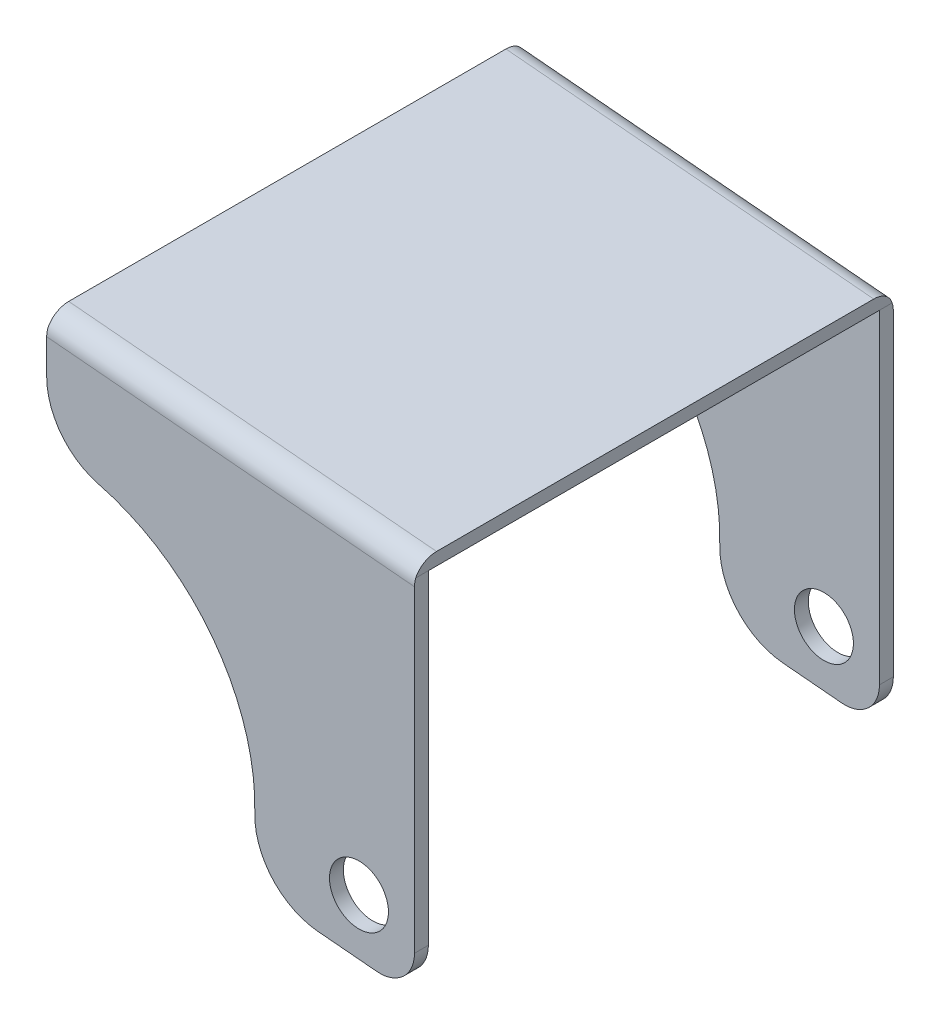
ISO-10303-21;
HEADER;
FILE_DESCRIPTION(('STEP AP214'),'2;1');
FILE_NAME('part.step','',(''),(''),'','','');
FILE_SCHEMA(('AUTOMOTIVE_DESIGN { 1 0 10303 214 1 1 1 1 }'));
ENDSEC;
DATA;
#1=APPLICATION_CONTEXT('core data for automotive mechanical design processes');
#2=APPLICATION_PROTOCOL_DEFINITION('international standard','automotive_design',2000,#1);
#3=PRODUCT_CONTEXT('',#1,'mechanical');
#4=PRODUCT('Part','Part','',(#3));
#5=PRODUCT_RELATED_PRODUCT_CATEGORY('part','',(#4));
#6=PRODUCT_DEFINITION_FORMATION('','',#4);
#7=PRODUCT_DEFINITION_CONTEXT('part definition',#1,'design');
#8=PRODUCT_DEFINITION('design','',#6,#7);
#9=PRODUCT_DEFINITION_SHAPE('','',#8);
#10=(LENGTH_UNIT() NAMED_UNIT(*) SI_UNIT(.MILLI.,.METRE.));
#11=(NAMED_UNIT(*) PLANE_ANGLE_UNIT() SI_UNIT($,.RADIAN.));
#12=(NAMED_UNIT(*) SI_UNIT($,.STERADIAN.) SOLID_ANGLE_UNIT());
#13=UNCERTAINTY_MEASURE_WITH_UNIT(LENGTH_MEASURE(1.E-05),#10,'distance_accuracy_value','');
#14=(GEOMETRIC_REPRESENTATION_CONTEXT(3) GLOBAL_UNCERTAINTY_ASSIGNED_CONTEXT((#13)) GLOBAL_UNIT_ASSIGNED_CONTEXT((#10,
#11,#12)) REPRESENTATION_CONTEXT('',''));
#15=CARTESIAN_POINT('',(0.,0.,0.));
#16=DIRECTION('',(0.,0.,1.));
#17=DIRECTION('',(1.,0.,0.));
#18=AXIS2_PLACEMENT_3D('',#15,#16,#17);
#19=CARTESIAN_POINT('',(-17.5,15.5152316254717,2.));
#20=DIRECTION('',(0.,0.,-1.));
#21=DIRECTION('',(-1.,0.,0.));
#22=AXIS2_PLACEMENT_3D('',#19,#20,#21);
#23=CYLINDRICAL_SURFACE('',#22,10.);
#24=CARTESIAN_POINT('',(-17.5,15.5152316254717,0.));
#25=DIRECTION('',(0.,0.,1.));
#26=DIRECTION('',(-1.,0.,0.));
#27=AXIS2_PLACEMENT_3D('',#24,#25,#26);
#28=CIRCLE('',#27,10.);
#29=CARTESIAN_POINT('',(-27.5,15.5152316254717,0.));
#30=VERTEX_POINT('',#29);
#31=CARTESIAN_POINT('',(-20.,5.83277325995317,0.));
#32=VERTEX_POINT('',#31);
#33=EDGE_CURVE('E277',#30,#32,#28,.T.);
#34=ORIENTED_EDGE('',*,*,#33,.T.);
#35=DIRECTION('',(0.,0.,-1.));
#36=VECTOR('',#35,1.);
#37=CARTESIAN_POINT('',(-20.,5.83277325995317,2.));
#38=LINE('',#37,#36);
#39=CARTESIAN_POINT('',(-20.,5.83277325995317,2.));
#40=VERTEX_POINT('',#39);
#41=EDGE_CURVE('E306',#40,#32,#38,.T.);
#42=ORIENTED_EDGE('',*,*,#41,.F.);
#43=CARTESIAN_POINT('',(-17.5,15.5152316254717,2.));
#44=DIRECTION('',(0.,0.,1.));
#45=DIRECTION('',(-1.,0.,0.));
#46=AXIS2_PLACEMENT_3D('',#43,#44,#45);
#47=CIRCLE('',#46,10.);
#48=CARTESIAN_POINT('',(-27.5,15.5152316254717,2.));
#49=VERTEX_POINT('',#48);
#50=EDGE_CURVE('E260',#49,#40,#47,.T.);
#51=ORIENTED_EDGE('',*,*,#50,.F.);
#52=DIRECTION('',(0.,0.,-1.));
#53=VECTOR('',#52,1.);
#54=CARTESIAN_POINT('',(-27.5,15.5152316254717,2.));
#55=LINE('',#54,#53);
#56=EDGE_CURVE('E276',#49,#30,#55,.T.);
#57=ORIENTED_EDGE('',*,*,#56,.T.);
#58=EDGE_LOOP('',(#34,#42,#51,#57));
#59=FACE_BOUND('',#58,.T.);
#60=ADVANCED_FACE('F33',(#59),#23,.T.);
#61=CARTESIAN_POINT('',(-27.5,-23.2146018366025,2.));
#62=DIRECTION('',(0.,0.,-1.));
#63=DIRECTION('',(-1.,0.,0.));
#64=AXIS2_PLACEMENT_3D('',#61,#62,#63);
#65=CYLINDRICAL_SURFACE('',#64,30.);
#66=CARTESIAN_POINT('',(-27.5,-23.2146018366025,0.));
#67=DIRECTION('',(0.,0.,-1.));
#68=DIRECTION('',(1.,0.,0.));
#69=AXIS2_PLACEMENT_3D('',#66,#67,#68);
#70=CIRCLE('',#69,30.);
#71=CARTESIAN_POINT('',(2.49062939224369,-23.9643675714085,0.));
#72=VERTEX_POINT('',#71);
#73=EDGE_CURVE('E280',#32,#72,#70,.T.);
#74=ORIENTED_EDGE('',*,*,#73,.T.);
#75=DIRECTION('',(0.,0.,-1.));
#76=VECTOR('',#75,1.);
#77=CARTESIAN_POINT('',(2.49062939224369,-23.9643675714085,2.));
#78=LINE('',#77,#76);
#79=CARTESIAN_POINT('',(2.49062939224369,-23.9643675714085,2.));
#80=VERTEX_POINT('',#79);
#81=EDGE_CURVE('E303',#80,#72,#78,.T.);
#82=ORIENTED_EDGE('',*,*,#81,.F.);
#83=CARTESIAN_POINT('',(-27.5,-23.2146018366025,2.));
#84=DIRECTION('',(0.,0.,-1.));
#85=DIRECTION('',(1.,0.,0.));
#86=AXIS2_PLACEMENT_3D('',#83,#84,#85);
#87=CIRCLE('',#86,30.);
#88=EDGE_CURVE('E263',#40,#80,#87,.T.);
#89=ORIENTED_EDGE('',*,*,#88,.F.);
#90=ORIENTED_EDGE('',*,*,#41,.T.);
#91=EDGE_LOOP('',(#74,#82,#89,#90));
#92=FACE_BOUND('',#91,.T.);
#93=ADVANCED_FACE('F403',(#92),#65,.F.);
#94=CARTESIAN_POINT('',(12.4875058563249,-24.2142894830106,2.));
#95=DIRECTION('',(0.,0.,-1.));
#96=DIRECTION('',(-1.,0.,0.));
#97=AXIS2_PLACEMENT_3D('',#94,#95,#96);
#98=CYLINDRICAL_SURFACE('',#97,10.);
#99=CARTESIAN_POINT('',(12.4875058563249,-24.2142894830106,0.));
#100=DIRECTION('',(0.,0.,1.));
#101=DIRECTION('',(-1.,0.,0.));
#102=AXIS2_PLACEMENT_3D('',#99,#100,#101);
#103=CIRCLE('',#102,10.);
#104=CARTESIAN_POINT('',(11.6031780779769,-34.1751109541766,0.));
#105=VERTEX_POINT('',#104);
#106=EDGE_CURVE('E282',#72,#105,#103,.T.);
#107=ORIENTED_EDGE('',*,*,#106,.T.);
#108=DIRECTION('',(0.,0.,-1.));
#109=VECTOR('',#108,1.);
#110=CARTESIAN_POINT('',(11.6031780779769,-34.1751109541766,2.));
#111=LINE('',#110,#109);
#112=CARTESIAN_POINT('',(11.6031780779769,-34.1751109541766,2.));
#113=VERTEX_POINT('',#112);
#114=EDGE_CURVE('E300',#113,#105,#111,.T.);
#115=ORIENTED_EDGE('',*,*,#114,.F.);
#116=CARTESIAN_POINT('',(12.4875058563249,-24.2142894830106,2.));
#117=DIRECTION('',(0.,0.,1.));
#118=DIRECTION('',(-1.,0.,0.));
#119=AXIS2_PLACEMENT_3D('',#116,#117,#118);
#120=CIRCLE('',#119,10.);
#121=EDGE_CURVE('E266',#80,#113,#120,.T.);
#122=ORIENTED_EDGE('',*,*,#121,.F.);
#123=ORIENTED_EDGE('',*,*,#81,.T.);
#124=EDGE_LOOP('',(#107,#115,#122,#123));
#125=FACE_BOUND('',#124,.T.);
#126=ADVANCED_FACE('F409',(#125),#98,.T.);
#127=CARTESIAN_POINT('',(25.5,-35.4088792424623,2.));
#128=DIRECTION('',(0.0884327778347987,0.996082147116603,0.));
#129=DIRECTION('',(-0.996082147116603,0.0884327778347987,0.));
#130=AXIS2_PLACEMENT_3D('',#127,#128,#129);
#131=PLANE('',#130);
#132=DIRECTION('',(0.996082147116603,-0.0884327778347987,0.));
#133=VECTOR('',#132,1.);
#134=CARTESIAN_POINT('',(25.5,-35.4088792424623,0.));
#135=LINE('',#134,#133);
#136=CARTESIAN_POINT('',(20.057836110826,-34.9257206279394,0.));
#137=VERTEX_POINT('',#136);
#138=EDGE_CURVE('E284',#105,#137,#135,.T.);
#139=ORIENTED_EDGE('',*,*,#138,.T.);
#140=DIRECTION('',(0.,0.,-1.));
#141=VECTOR('',#140,1.);
#142=CARTESIAN_POINT('',(20.057836110826,-34.9257206279394,2.));
#143=LINE('',#142,#141);
#144=CARTESIAN_POINT('',(20.057836110826,-34.9257206279394,2.));
#145=VERTEX_POINT('',#144);
#146=EDGE_CURVE('E314',#137,#145,#143,.F.);
#147=ORIENTED_EDGE('',*,*,#146,.T.);
#148=DIRECTION('',(0.996082147116603,-0.0884327778347987,0.));
#149=VECTOR('',#148,1.);
#150=CARTESIAN_POINT('',(25.5,-35.4088792424623,2.));
#151=LINE('',#150,#149);
#152=EDGE_CURVE('E268',#113,#145,#151,.T.);
#153=ORIENTED_EDGE('',*,*,#152,.F.);
#154=ORIENTED_EDGE('',*,*,#114,.T.);
#155=EDGE_LOOP('',(#139,#147,#153,#154));
#156=FACE_BOUND('',#155,.T.);
#157=ADVANCED_FACE('F471',(#156),#131,.F.);
#158=CARTESIAN_POINT('',(25.5,16.7956504246203,2.));
#159=DIRECTION('',(-1.,0.,0.));
#160=DIRECTION('',(0.,-1.,0.));
#161=AXIS2_PLACEMENT_3D('',#158,#159,#160);
#162=PLANE('',#161);
#163=DIRECTION('',(0.,0.,-1.));
#164=VECTOR('',#163,1.);
#165=CARTESIAN_POINT('',(25.5,16.7956504246203,2.));
#166=LINE('',#165,#164);
#167=CARTESIAN_POINT('',(25.5,16.7956504246203,1.82842712474619));
#168=VERTEX_POINT('',#167);
#169=CARTESIAN_POINT('',(25.5,16.7956504246203,0.));
#170=VERTEX_POINT('',#169);
#171=EDGE_CURVE('E298',#168,#170,#166,.T.);
#172=ORIENTED_EDGE('',*,*,#171,.F.);
#173=CARTESIAN_POINT('',(25.5,15.7917171617918,-1.));
#174=DIRECTION('',(-1.,0.,0.));
#175=DIRECTION('',(0.,1.,0.));
#176=AXIS2_PLACEMENT_3D('',#173,#174,#175);
#177=ELLIPSE('',#176,3.01179978848553,3.);
#178=CARTESIAN_POINT('',(25.5,15.7917171617918,2.));
#179=VERTEX_POINT('',#178);
#180=EDGE_CURVE('E330',#168,#179,#177,.F.);
#181=ORIENTED_EDGE('',*,*,#180,.T.);
#182=DIRECTION('',(0.,1.,0.));
#183=VECTOR('',#182,1.);
#184=CARTESIAN_POINT('',(25.5,16.7956504246203,2.));
#185=LINE('',#184,#183);
#186=CARTESIAN_POINT('',(25.5,-29.9453098923564,2.));
#187=VERTEX_POINT('',#186);
#188=EDGE_CURVE('E271',#187,#179,#185,.T.);
#189=ORIENTED_EDGE('',*,*,#188,.F.);
#190=DIRECTION('',(0.,0.,-1.));
#191=VECTOR('',#190,1.);
#192=CARTESIAN_POINT('',(25.5,-29.9453098923564,2.));
#193=LINE('',#192,#191);
#194=CARTESIAN_POINT('',(25.5,-29.9453098923564,0.));
#195=VERTEX_POINT('',#194);
#196=EDGE_CURVE('E309',#187,#195,#193,.T.);
#197=ORIENTED_EDGE('',*,*,#196,.T.);
#198=DIRECTION('',(0.,1.,0.));
#199=VECTOR('',#198,1.);
#200=CARTESIAN_POINT('',(25.5,16.7956504246203,0.));
#201=LINE('',#200,#199);
#202=EDGE_CURVE('E287',#195,#170,#201,.T.);
#203=ORIENTED_EDGE('',*,*,#202,.T.);
#204=EDGE_LOOP('',(#172,#181,#189,#197,#203));
#205=FACE_BOUND('',#204,.T.);
#206=ADVANCED_FACE('F360',(#205),#162,.F.);
#207=CARTESIAN_POINT('',(-27.5,15.5152316254717,2.));
#208=DIRECTION('',(1.,0.,0.));
#209=DIRECTION('',(0.,0.,-1.));
#210=AXIS2_PLACEMENT_3D('',#207,#208,#209);
#211=PLANE('',#210);
#212=DIRECTION('',(0.,-1.,0.));
#213=VECTOR('',#212,1.);
#214=CARTESIAN_POINT('',(-27.5,15.5152316254717,2.));
#215=LINE('',#214,#213);
#216=CARTESIAN_POINT('',(-27.5,20.4970893430037,2.));
#217=VERTEX_POINT('',#216);
#218=EDGE_CURVE('E274',#217,#49,#215,.T.);
#219=ORIENTED_EDGE('',*,*,#218,.F.);
#220=CARTESIAN_POINT('',(-27.5,20.4970893430037,-1.));
#221=DIRECTION('',(1.,0.,0.));
#222=DIRECTION('',(0.,1.,0.));
#223=AXIS2_PLACEMENT_3D('',#220,#221,#222);
#224=ELLIPSE('',#223,3.01179978848553,3.);
#225=CARTESIAN_POINT('',(-27.5,21.5010226058322,1.82842712474619));
#226=VERTEX_POINT('',#225);
#227=EDGE_CURVE('E334',#217,#226,#224,.F.);
#228=ORIENTED_EDGE('',*,*,#227,.T.);
#229=DIRECTION('',(0.,0.,-1.));
#230=VECTOR('',#229,1.);
#231=CARTESIAN_POINT('',(-27.5,21.5010226058322,2.));
#232=LINE('',#231,#230);
#233=CARTESIAN_POINT('',(-27.5,21.5010226058322,0.));
#234=VERTEX_POINT('',#233);
#235=EDGE_CURVE('E296',#226,#234,#232,.T.);
#236=ORIENTED_EDGE('',*,*,#235,.T.);
#237=DIRECTION('',(0.,-1.,0.));
#238=VECTOR('',#237,1.);
#239=CARTESIAN_POINT('',(-27.5,15.5152316254717,0.));
#240=LINE('',#239,#238);
#241=EDGE_CURVE('E264',#234,#30,#240,.T.);
#242=ORIENTED_EDGE('',*,*,#241,.T.);
#243=ORIENTED_EDGE('',*,*,#56,.F.);
#244=EDGE_LOOP('',(#219,#228,#236,#242,#243));
#245=FACE_BOUND('',#244,.T.);
#246=ADVANCED_FACE('F470',(#245),#211,.F.);
#247=CARTESIAN_POINT('',(-17.5,15.5152316254717,2.));
#248=DIRECTION('',(0.,0.,-1.));
#249=DIRECTION('',(-1.,0.,0.));
#250=AXIS2_PLACEMENT_3D('',#247,#248,#249);
#251=PLANE('',#250);
#252=CARTESIAN_POINT('',(17.5,-26.6671682822928,2.));
#253=DIRECTION('',(0.,0.,1.));
#254=DIRECTION('',(1.,0.,0.));
#255=AXIS2_PLACEMENT_3D('',#252,#253,#254);
#256=CIRCLE('',#255,4.25);
#257=CARTESIAN_POINT('',(21.75,-26.6671682822928,2.));
#258=VERTEX_POINT('',#257);
#259=EDGE_CURVE('E252',#258,#258,#256,.T.);
#260=ORIENTED_EDGE('',*,*,#259,.F.);
#261=EDGE_LOOP('',(#260));
#262=FACE_BOUND('',#261,.T.);
#263=ORIENTED_EDGE('',*,*,#188,.T.);
#264=DIRECTION('',(0.996082147116603,-0.0884327778347982,0.));
#265=VECTOR('',#264,1.);
#266=CARTESIAN_POINT('',(-27.5884327778348,20.5049404587156,2.));
#267=LINE('',#266,#265);
#268=EDGE_CURVE('E332',#179,#217,#267,.F.);
#269=ORIENTED_EDGE('',*,*,#268,.T.);
#270=ORIENTED_EDGE('',*,*,#218,.T.);
#271=ORIENTED_EDGE('',*,*,#50,.T.);
#272=ORIENTED_EDGE('',*,*,#88,.T.);
#273=ORIENTED_EDGE('',*,*,#121,.T.);
#274=ORIENTED_EDGE('',*,*,#152,.T.);
#275=CARTESIAN_POINT('',(20.5,-29.9453098923564,2.));
#276=DIRECTION('',(0.,0.,-1.));
#277=DIRECTION('',(-1.,0.,0.));
#278=AXIS2_PLACEMENT_3D('',#275,#276,#277);
#279=CIRCLE('',#278,5.);
#280=EDGE_CURVE('E316',#145,#187,#279,.F.);
#281=ORIENTED_EDGE('',*,*,#280,.T.);
#282=EDGE_LOOP('',(#263,#269,#270,#271,#272,#273,#274,#281));
#283=FACE_BOUND('',#282,.T.);
#284=ADVANCED_FACE('F482',(#262,#283),#251,.F.);
#285=CARTESIAN_POINT('',(-17.5,15.5152316254717,0.));
#286=DIRECTION('',(0.,0.,-1.));
#287=DIRECTION('',(-1.,0.,0.));
#288=AXIS2_PLACEMENT_3D('',#285,#286,#287);
#289=PLANE('',#288);
#290=CARTESIAN_POINT('',(17.5,-26.6671682822928,0.));
#291=DIRECTION('',(0.,0.,-1.));
#292=DIRECTION('',(-1.,0.,0.));
#293=AXIS2_PLACEMENT_3D('',#290,#291,#292);
#294=CIRCLE('',#293,4.25);
#295=CARTESIAN_POINT('',(13.25,-26.6671682822928,0.));
#296=VERTEX_POINT('',#295);
#297=EDGE_CURVE('E259',#296,#296,#294,.T.);
#298=ORIENTED_EDGE('',*,*,#297,.F.);
#299=EDGE_LOOP('',(#298));
#300=FACE_BOUND('',#299,.T.);
#301=ORIENTED_EDGE('',*,*,#202,.F.);
#302=CARTESIAN_POINT('',(20.5,-29.9453098923564,0.));
#303=DIRECTION('',(0.,0.,-1.));
#304=DIRECTION('',(-1.,0.,0.));
#305=AXIS2_PLACEMENT_3D('',#302,#303,#304);
#306=CIRCLE('',#305,5.);
#307=EDGE_CURVE('E312',#195,#137,#306,.T.);
#308=ORIENTED_EDGE('',*,*,#307,.T.);
#309=ORIENTED_EDGE('',*,*,#138,.F.);
#310=ORIENTED_EDGE('',*,*,#106,.F.);
#311=ORIENTED_EDGE('',*,*,#73,.F.);
#312=ORIENTED_EDGE('',*,*,#33,.F.);
#313=ORIENTED_EDGE('',*,*,#241,.F.);
#314=DIRECTION('',(-0.996082147116603,0.0884327778347981,0.));
#315=VECTOR('',#314,1.);
#316=CARTESIAN_POINT('',(-27.5,21.5010226058322,0.));
#317=LINE('',#316,#315);
#318=EDGE_CURVE('E290',#170,#234,#317,.T.);
#319=ORIENTED_EDGE('',*,*,#318,.F.);
#320=EDGE_LOOP('',(#301,#308,#309,#310,#311,#312,#313,#319));
#321=FACE_BOUND('',#320,.T.);
#322=ADVANCED_FACE('F368',(#300,#321),#289,.T.);
#323=CARTESIAN_POINT('',(20.5,-29.9453098923564,2.));
#324=DIRECTION('',(0.,0.,-1.));
#325=DIRECTION('',(-1.,0.,0.));
#326=AXIS2_PLACEMENT_3D('',#323,#324,#325);
#327=CYLINDRICAL_SURFACE('',#326,5.);
#328=ORIENTED_EDGE('',*,*,#280,.F.);
#329=ORIENTED_EDGE('',*,*,#146,.F.);
#330=ORIENTED_EDGE('',*,*,#307,.F.);
#331=ORIENTED_EDGE('',*,*,#196,.F.);
#332=EDGE_LOOP('',(#328,#329,#330,#331));
#333=FACE_BOUND('',#332,.T.);
#334=ADVANCED_FACE('F414',(#333),#327,.T.);
#335=CARTESIAN_POINT('',(17.5,-26.6671682822928,-8.));
#336=DIRECTION('',(0.,0.,1.));
#337=DIRECTION('',(1.,0.,0.));
#338=AXIS2_PLACEMENT_3D('',#335,#336,#337);
#339=CYLINDRICAL_SURFACE('',#338,4.25);
#340=ORIENTED_EDGE('',*,*,#297,.T.);
#341=EDGE_LOOP('',(#340));
#342=FACE_BOUND('',#341,.T.);
#343=ORIENTED_EDGE('',*,*,#259,.T.);
#344=EDGE_LOOP('',(#343));
#345=FACE_BOUND('',#344,.T.);
#346=ADVANCED_FACE('F416',(#342,#345),#339,.F.);
#347=CARTESIAN_POINT('',(-27.3231344443304,23.4931869000654,-67.));
#348=DIRECTION('',(0.996082147116603,-0.0884327778347981,0.));
#349=DIRECTION('',(0.0884327778347981,0.996082147116603,0.));
#350=AXIS2_PLACEMENT_3D('',#347,#348,#349);
#351=PLANE('',#350);
#352=ORIENTED_EDGE('',*,*,#235,.F.);
#353=CARTESIAN_POINT('',(-27.5884327778348,20.5049404587156,-1.));
#354=DIRECTION('',(0.996082147116603,-0.0884327778347981,0.));
#355=DIRECTION('',(0.0884327778347981,0.996082147116603,0.));
#356=AXIS2_PLACEMENT_3D('',#353,#354,#355);
#357=CIRCLE('',#356,3.);
#358=CARTESIAN_POINT('',(-27.3231344443304,23.4931869000654,-1.));
#359=VERTEX_POINT('',#358);
#360=EDGE_CURVE('E338',#226,#359,#357,.F.);
#361=ORIENTED_EDGE('',*,*,#360,.T.);
#362=DIRECTION('',(0.,0.,1.));
#363=VECTOR('',#362,1.);
#364=CARTESIAN_POINT('',(-27.3231344443304,23.4931869000654,-67.));
#365=LINE('',#364,#363);
#366=CARTESIAN_POINT('',(-27.3231344443304,23.4931869000654,-64.));
#367=VERTEX_POINT('',#366);
#368=EDGE_CURVE('E245',#367,#359,#365,.T.);
#369=ORIENTED_EDGE('',*,*,#368,.F.);
#370=CARTESIAN_POINT('',(-27.5884327778348,20.5049404587156,-64.));
#371=DIRECTION('',(0.996082147116603,-0.0884327778347981,0.));
#372=DIRECTION('',(0.0884327778347981,0.996082147116603,0.));
#373=AXIS2_PLACEMENT_3D('',#370,#371,#372);
#374=CIRCLE('',#373,3.);
#375=CARTESIAN_POINT('',(-27.5,21.5010226058322,-66.8284271247462));
#376=VERTEX_POINT('',#375);
#377=EDGE_CURVE('E336',#367,#376,#374,.F.);
#378=ORIENTED_EDGE('',*,*,#377,.T.);
#379=DIRECTION('',(0.,0.,1.));
#380=VECTOR('',#379,1.);
#381=CARTESIAN_POINT('',(-27.5,21.5010226058322,-67.));
#382=LINE('',#381,#380);
#383=CARTESIAN_POINT('',(-27.5,21.5010226058322,-65.));
#384=VERTEX_POINT('',#383);
#385=EDGE_CURVE('E253',#376,#384,#382,.T.);
#386=ORIENTED_EDGE('',*,*,#385,.T.);
#387=EDGE_CURVE('E242',#384,#234,#382,.T.);
#388=ORIENTED_EDGE('',*,*,#387,.T.);
#389=EDGE_LOOP('',(#352,#361,#369,#378,#386,#388));
#390=FACE_BOUND('',#389,.T.);
#391=ADVANCED_FACE('F344',(#390),#351,.F.);
#392=CARTESIAN_POINT('',(25.6768655556696,18.7878147188535,-67.));
#393=DIRECTION('',(-0.996082147116603,0.0884327778347981,0.));
#394=DIRECTION('',(-0.0884327778347981,-0.996082147116603,0.));
#395=AXIS2_PLACEMENT_3D('',#392,#393,#394);
#396=PLANE('',#395);
#397=DIRECTION('',(0.,0.,-1.));
#398=VECTOR('',#397,1.);
#399=CARTESIAN_POINT('',(25.6768655556696,18.7878147188535,-67.));
#400=LINE('',#399,#398);
#401=CARTESIAN_POINT('',(25.6768655556696,18.7878147188535,-1.));
#402=VERTEX_POINT('',#401);
#403=CARTESIAN_POINT('',(25.6768655556696,18.7878147188535,-64.));
#404=VERTEX_POINT('',#403);
#405=EDGE_CURVE('E248',#402,#404,#400,.T.);
#406=ORIENTED_EDGE('',*,*,#405,.F.);
#407=CARTESIAN_POINT('',(25.4115672221652,15.7995682775037,-1.));
#408=DIRECTION('',(-0.996082147116603,0.0884327778347981,0.));
#409=DIRECTION('',(-0.0884327778347981,-0.996082147116603,0.));
#410=AXIS2_PLACEMENT_3D('',#407,#408,#409);
#411=CIRCLE('',#410,3.);
#412=EDGE_CURVE('E328',#402,#168,#411,.F.);
#413=ORIENTED_EDGE('',*,*,#412,.T.);
#414=ORIENTED_EDGE('',*,*,#171,.T.);
#415=DIRECTION('',(0.,0.,-1.));
#416=VECTOR('',#415,1.);
#417=CARTESIAN_POINT('',(25.5,16.7956504246203,-67.));
#418=LINE('',#417,#416);
#419=CARTESIAN_POINT('',(25.5,16.7956504246203,-65.));
#420=VERTEX_POINT('',#419);
#421=EDGE_CURVE('E249',#170,#420,#418,.T.);
#422=ORIENTED_EDGE('',*,*,#421,.T.);
#423=DIRECTION('',(0.,0.,1.));
#424=VECTOR('',#423,1.);
#425=CARTESIAN_POINT('',(25.5,16.7956504246203,-67.));
#426=LINE('',#425,#424);
#427=CARTESIAN_POINT('',(25.5,16.7956504246203,-66.8284271247462));
#428=VERTEX_POINT('',#427);
#429=EDGE_CURVE('E227',#428,#420,#426,.T.);
#430=ORIENTED_EDGE('',*,*,#429,.F.);
#431=CARTESIAN_POINT('',(25.4115672221652,15.7995682775037,-64.));
#432=DIRECTION('',(-0.996082147116603,0.0884327778347981,0.));
#433=DIRECTION('',(-0.0884327778347981,-0.996082147116603,0.));
#434=AXIS2_PLACEMENT_3D('',#431,#432,#433);
#435=CIRCLE('',#434,3.);
#436=EDGE_CURVE('E326',#428,#404,#435,.F.);
#437=ORIENTED_EDGE('',*,*,#436,.T.);
#438=EDGE_LOOP('',(#406,#413,#414,#422,#430,#437));
#439=FACE_BOUND('',#438,.T.);
#440=ADVANCED_FACE('F358',(#439),#396,.F.);
#441=CARTESIAN_POINT('',(-27.3231344443304,23.4931869000654,-67.));
#442=DIRECTION('',(0.,0.,1.));
#443=DIRECTION('',(1.,0.,0.));
#444=AXIS2_PLACEMENT_3D('',#441,#442,#443);
#445=PLANE('',#444);
#446=DIRECTION('',(0.,-1.,0.));
#447=VECTOR('',#446,1.);
#448=CARTESIAN_POINT('',(-27.5,15.5152316254717,-67.));
#449=LINE('',#448,#447);
#450=CARTESIAN_POINT('',(-27.5,20.4970893430037,-67.));
#451=VERTEX_POINT('',#450);
#452=CARTESIAN_POINT('',(-27.5,15.5152316254717,-67.));
#453=VERTEX_POINT('',#452);
#454=EDGE_CURVE('E209',#451,#453,#449,.T.);
#455=ORIENTED_EDGE('',*,*,#454,.F.);
#456=DIRECTION('',(-0.996082147116603,0.0884327778347982,0.));
#457=VECTOR('',#456,1.);
#458=CARTESIAN_POINT('',(25.4115672221652,15.7995682775037,-67.));
#459=LINE('',#458,#457);
#460=CARTESIAN_POINT('',(25.5,15.7917171617918,-67.));
#461=VERTEX_POINT('',#460);
#462=EDGE_CURVE('E41',#451,#461,#459,.F.);
#463=ORIENTED_EDGE('',*,*,#462,.T.);
#464=DIRECTION('',(0.,1.,0.));
#465=VECTOR('',#464,1.);
#466=CARTESIAN_POINT('',(25.5,16.7956504246203,-67.));
#467=LINE('',#466,#465);
#468=CARTESIAN_POINT('',(25.5,-29.9453098923564,-67.));
#469=VERTEX_POINT('',#468);
#470=EDGE_CURVE('E207',#469,#461,#467,.T.);
#471=ORIENTED_EDGE('',*,*,#470,.F.);
#472=CARTESIAN_POINT('',(20.5,-29.9453098923564,-67.));
#473=DIRECTION('',(0.,0.,-1.));
#474=DIRECTION('',(-1.,0.,0.));
#475=AXIS2_PLACEMENT_3D('',#472,#473,#474);
#476=CIRCLE('',#475,5.);
#477=CARTESIAN_POINT('',(20.057836110826,-34.9257206279394,-67.));
#478=VERTEX_POINT('',#477);
#479=EDGE_CURVE('E240',#478,#469,#476,.F.);
#480=ORIENTED_EDGE('',*,*,#479,.F.);
#481=DIRECTION('',(0.996082147116603,-0.0884327778347987,0.));
#482=VECTOR('',#481,1.);
#483=CARTESIAN_POINT('',(25.5,-35.4088792424623,-67.));
#484=LINE('',#483,#482);
#485=CARTESIAN_POINT('',(11.6031780779769,-34.1751109541766,-67.));
#486=VERTEX_POINT('',#485);
#487=EDGE_CURVE('E204',#486,#478,#484,.T.);
#488=ORIENTED_EDGE('',*,*,#487,.F.);
#489=CARTESIAN_POINT('',(12.4875058563249,-24.2142894830106,-67.));
#490=DIRECTION('',(0.,0.,1.));
#491=DIRECTION('',(-1.,0.,0.));
#492=AXIS2_PLACEMENT_3D('',#489,#490,#491);
#493=CIRCLE('',#492,10.);
#494=CARTESIAN_POINT('',(2.49062939224369,-23.9643675714085,-67.));
#495=VERTEX_POINT('',#494);
#496=EDGE_CURVE('E177',#495,#486,#493,.T.);
#497=ORIENTED_EDGE('',*,*,#496,.F.);
#498=CARTESIAN_POINT('',(-27.5,-23.2146018366025,-67.));
#499=DIRECTION('',(0.,0.,-1.));
#500=DIRECTION('',(1.,0.,0.));
#501=AXIS2_PLACEMENT_3D('',#498,#499,#500);
#502=CIRCLE('',#501,30.);
#503=CARTESIAN_POINT('',(-20.,5.83277325995317,-67.));
#504=VERTEX_POINT('',#503);
#505=EDGE_CURVE('E169',#504,#495,#502,.T.);
#506=ORIENTED_EDGE('',*,*,#505,.F.);
#507=CARTESIAN_POINT('',(-17.5,15.5152316254717,-67.));
#508=DIRECTION('',(0.,0.,1.));
#509=DIRECTION('',(-1.,0.,0.));
#510=AXIS2_PLACEMENT_3D('',#507,#508,#509);
#511=CIRCLE('',#510,10.);
#512=EDGE_CURVE('E174',#453,#504,#511,.T.);
#513=ORIENTED_EDGE('',*,*,#512,.F.);
#514=EDGE_LOOP('',(#455,#463,#471,#480,#488,#497,#506,#513));
#515=FACE_BOUND('',#514,.T.);
#516=CARTESIAN_POINT('',(17.5,-26.6671682822928,-67.));
#517=DIRECTION('',(0.,0.,1.));
#518=DIRECTION('',(1.,0.,0.));
#519=AXIS2_PLACEMENT_3D('',#516,#517,#518);
#520=CIRCLE('',#519,4.25);
#521=CARTESIAN_POINT('',(21.75,-26.6671682822928,-67.));
#522=VERTEX_POINT('',#521);
#523=EDGE_CURVE('E201',#522,#522,#520,.T.);
#524=ORIENTED_EDGE('',*,*,#523,.T.);
#525=EDGE_LOOP('',(#524));
#526=FACE_BOUND('',#525,.T.);
#527=ADVANCED_FACE('F171',(#515,#526),#445,.F.);
#528=CARTESIAN_POINT('',(1.85575152912195,20.9026676861364,0.));
#529=DIRECTION('',(0.0884327778347982,0.996082147116603,0.));
#530=DIRECTION('',(-0.996082147116603,0.0884327778347982,0.));
#531=AXIS2_PLACEMENT_3D('',#528,#529,#530);
#532=PLANE('',#531);
#533=ORIENTED_EDGE('',*,*,#368,.T.);
#534=DIRECTION('',(0.996082147116603,-0.0884327778347982,0.));
#535=VECTOR('',#534,1.);
#536=CARTESIAN_POINT('',(25.6768655556696,18.7878147188535,-1.));
#537=LINE('',#536,#535);
#538=EDGE_CURVE('E323',#359,#402,#537,.T.);
#539=ORIENTED_EDGE('',*,*,#538,.T.);
#540=ORIENTED_EDGE('',*,*,#405,.T.);
#541=DIRECTION('',(-0.996082147116603,0.0884327778347982,0.));
#542=VECTOR('',#541,1.);
#543=CARTESIAN_POINT('',(-27.3231344443304,23.4931869000654,-64.));
#544=LINE('',#543,#542);
#545=EDGE_CURVE('E318',#404,#367,#544,.T.);
#546=ORIENTED_EDGE('',*,*,#545,.T.);
#547=EDGE_LOOP('',(#533,#539,#540,#546));
#548=FACE_BOUND('',#547,.T.);
#549=ADVANCED_FACE('F350',(#548),#532,.T.);
#550=CARTESIAN_POINT('',(1.67888597345236,18.9105033919032,0.));
#551=DIRECTION('',(0.0884327778347982,0.996082147116603,0.));
#552=DIRECTION('',(-0.996082147116603,0.0884327778347982,0.));
#553=AXIS2_PLACEMENT_3D('',#550,#551,#552);
#554=PLANE('',#553);
#555=ORIENTED_EDGE('',*,*,#387,.F.);
#556=DIRECTION('',(-0.996082147116603,0.0884327778347981,0.));
#557=VECTOR('',#556,1.);
#558=CARTESIAN_POINT('',(-27.5,21.5010226058322,-65.));
#559=LINE('',#558,#557);
#560=EDGE_CURVE('E198',#420,#384,#559,.T.);
#561=ORIENTED_EDGE('',*,*,#560,.F.);
#562=ORIENTED_EDGE('',*,*,#421,.F.);
#563=ORIENTED_EDGE('',*,*,#318,.T.);
#564=EDGE_LOOP('',(#555,#561,#562,#563));
#565=FACE_BOUND('',#564,.T.);
#566=ADVANCED_FACE('F373',(#565),#554,.F.);
#567=CARTESIAN_POINT('',(-17.5,15.5152316254717,-67.));
#568=DIRECTION('',(0.,0.,1.));
#569=DIRECTION('',(-1.,0.,0.));
#570=AXIS2_PLACEMENT_3D('',#567,#568,#569);
#571=CYLINDRICAL_SURFACE('',#570,10.);
#572=CARTESIAN_POINT('',(-17.5,15.5152316254717,-65.));
#573=DIRECTION('',(0.,0.,1.));
#574=DIRECTION('',(-1.,0.,0.));
#575=AXIS2_PLACEMENT_3D('',#572,#573,#574);
#576=CIRCLE('',#575,10.);
#577=CARTESIAN_POINT('',(-27.5,15.5152316254717,-65.));
#578=VERTEX_POINT('',#577);
#579=CARTESIAN_POINT('',(-20.,5.83277325995317,-65.));
#580=VERTEX_POINT('',#579);
#581=EDGE_CURVE('E211',#578,#580,#576,.T.);
#582=ORIENTED_EDGE('',*,*,#581,.F.);
#583=DIRECTION('',(0.,0.,1.));
#584=VECTOR('',#583,1.);
#585=CARTESIAN_POINT('',(-27.5,15.5152316254717,-67.));
#586=LINE('',#585,#584);
#587=EDGE_CURVE('E195',#453,#578,#586,.T.);
#588=ORIENTED_EDGE('',*,*,#587,.F.);
#589=ORIENTED_EDGE('',*,*,#512,.T.);
#590=DIRECTION('',(0.,0.,1.));
#591=VECTOR('',#590,1.);
#592=CARTESIAN_POINT('',(-20.,5.83277325995317,-67.));
#593=LINE('',#592,#591);
#594=EDGE_CURVE('E183',#504,#580,#593,.T.);
#595=ORIENTED_EDGE('',*,*,#594,.T.);
#596=EDGE_LOOP('',(#582,#588,#589,#595));
#597=FACE_BOUND('',#596,.T.);
#598=ADVANCED_FACE('F193',(#597),#571,.T.);
#599=CARTESIAN_POINT('',(-27.5,-23.2146018366025,-67.));
#600=DIRECTION('',(0.,0.,1.));
#601=DIRECTION('',(-1.,0.,0.));
#602=AXIS2_PLACEMENT_3D('',#599,#600,#601);
#603=CYLINDRICAL_SURFACE('',#602,30.);
#604=CARTESIAN_POINT('',(-27.5,-23.2146018366025,-65.));
#605=DIRECTION('',(0.,0.,-1.));
#606=DIRECTION('',(1.,0.,0.));
#607=AXIS2_PLACEMENT_3D('',#604,#605,#606);
#608=CIRCLE('',#607,30.);
#609=CARTESIAN_POINT('',(2.49062939224369,-23.9643675714085,-65.));
#610=VERTEX_POINT('',#609);
#611=EDGE_CURVE('E186',#580,#610,#608,.T.);
#612=ORIENTED_EDGE('',*,*,#611,.F.);
#613=ORIENTED_EDGE('',*,*,#594,.F.);
#614=ORIENTED_EDGE('',*,*,#505,.T.);
#615=DIRECTION('',(0.,0.,1.));
#616=VECTOR('',#615,1.);
#617=CARTESIAN_POINT('',(2.49062939224369,-23.9643675714085,-67.));
#618=LINE('',#617,#616);
#619=EDGE_CURVE('E191',#495,#610,#618,.T.);
#620=ORIENTED_EDGE('',*,*,#619,.T.);
#621=EDGE_LOOP('',(#612,#613,#614,#620));
#622=FACE_BOUND('',#621,.T.);
#623=ADVANCED_FACE('F184',(#622),#603,.F.);
#624=CARTESIAN_POINT('',(12.4875058563249,-24.2142894830106,-67.));
#625=DIRECTION('',(0.,0.,1.));
#626=DIRECTION('',(-1.,0.,0.));
#627=AXIS2_PLACEMENT_3D('',#624,#625,#626);
#628=CYLINDRICAL_SURFACE('',#627,10.);
#629=CARTESIAN_POINT('',(12.4875058563249,-24.2142894830106,-65.));
#630=DIRECTION('',(0.,0.,1.));
#631=DIRECTION('',(-1.,0.,0.));
#632=AXIS2_PLACEMENT_3D('',#629,#630,#631);
#633=CIRCLE('',#632,10.);
#634=CARTESIAN_POINT('',(11.6031780779769,-34.1751109541766,-65.));
#635=VERTEX_POINT('',#634);
#636=EDGE_CURVE('E215',#610,#635,#633,.T.);
#637=ORIENTED_EDGE('',*,*,#636,.F.);
#638=ORIENTED_EDGE('',*,*,#619,.F.);
#639=ORIENTED_EDGE('',*,*,#496,.T.);
#640=DIRECTION('',(0.,0.,1.));
#641=VECTOR('',#640,1.);
#642=CARTESIAN_POINT('',(11.6031780779769,-34.1751109541766,-67.));
#643=LINE('',#642,#641);
#644=EDGE_CURVE('E229',#486,#635,#643,.T.);
#645=ORIENTED_EDGE('',*,*,#644,.T.);
#646=EDGE_LOOP('',(#637,#638,#639,#645));
#647=FACE_BOUND('',#646,.T.);
#648=ADVANCED_FACE('F393',(#647),#628,.T.);
#649=CARTESIAN_POINT('',(25.5,-35.4088792424623,-67.));
#650=DIRECTION('',(0.0884327778347987,0.996082147116603,0.));
#651=DIRECTION('',(-0.996082147116603,0.0884327778347987,0.));
#652=AXIS2_PLACEMENT_3D('',#649,#650,#651);
#653=PLANE('',#652);
#654=DIRECTION('',(0.996082147116603,-0.0884327778347987,0.));
#655=VECTOR('',#654,1.);
#656=CARTESIAN_POINT('',(25.5,-35.4088792424623,-65.));
#657=LINE('',#656,#655);
#658=CARTESIAN_POINT('',(20.057836110826,-34.9257206279394,-65.));
#659=VERTEX_POINT('',#658);
#660=EDGE_CURVE('E218',#635,#659,#657,.T.);
#661=ORIENTED_EDGE('',*,*,#660,.F.);
#662=ORIENTED_EDGE('',*,*,#644,.F.);
#663=ORIENTED_EDGE('',*,*,#487,.T.);
#664=DIRECTION('',(0.,0.,1.));
#665=VECTOR('',#664,1.);
#666=CARTESIAN_POINT('',(20.057836110826,-34.9257206279394,-67.));
#667=LINE('',#666,#665);
#668=EDGE_CURVE('E237',#659,#478,#667,.F.);
#669=ORIENTED_EDGE('',*,*,#668,.F.);
#670=EDGE_LOOP('',(#661,#662,#663,#669));
#671=FACE_BOUND('',#670,.T.);
#672=ADVANCED_FACE('F391',(#671),#653,.F.);
#673=CARTESIAN_POINT('',(25.5,16.7956504246203,-67.));
#674=DIRECTION('',(-1.,0.,0.));
#675=DIRECTION('',(0.,-1.,0.));
#676=AXIS2_PLACEMENT_3D('',#673,#674,#675);
#677=PLANE('',#676);
#678=ORIENTED_EDGE('',*,*,#470,.T.);
#679=CARTESIAN_POINT('',(25.5,15.7917171617918,-64.));
#680=DIRECTION('',(-1.,0.,0.));
#681=DIRECTION('',(0.,-1.,0.));
#682=AXIS2_PLACEMENT_3D('',#679,#680,#681);
#683=ELLIPSE('',#682,3.01179978848553,3.);
#684=EDGE_CURVE('E11',#461,#428,#683,.F.);
#685=ORIENTED_EDGE('',*,*,#684,.T.);
#686=ORIENTED_EDGE('',*,*,#429,.T.);
#687=DIRECTION('',(0.,1.,0.));
#688=VECTOR('',#687,1.);
#689=CARTESIAN_POINT('',(25.5,16.7956504246203,-65.));
#690=LINE('',#689,#688);
#691=CARTESIAN_POINT('',(25.5,-29.9453098923564,-65.));
#692=VERTEX_POINT('',#691);
#693=EDGE_CURVE('E221',#692,#420,#690,.T.);
#694=ORIENTED_EDGE('',*,*,#693,.F.);
#695=DIRECTION('',(0.,0.,1.));
#696=VECTOR('',#695,1.);
#697=CARTESIAN_POINT('',(25.5,-29.9453098923564,-67.));
#698=LINE('',#697,#696);
#699=EDGE_CURVE('E190',#469,#692,#698,.T.);
#700=ORIENTED_EDGE('',*,*,#699,.F.);
#701=EDGE_LOOP('',(#678,#685,#686,#694,#700));
#702=FACE_BOUND('',#701,.T.);
#703=ADVANCED_FACE('F385',(#702),#677,.F.);
#704=CARTESIAN_POINT('',(-27.5,15.5152316254717,-67.));
#705=DIRECTION('',(1.,0.,0.));
#706=DIRECTION('',(0.,0.,1.));
#707=AXIS2_PLACEMENT_3D('',#704,#705,#706);
#708=PLANE('',#707);
#709=ORIENTED_EDGE('',*,*,#385,.F.);
#710=CARTESIAN_POINT('',(-27.5,20.4970893430037,-64.));
#711=DIRECTION('',(1.,0.,0.));
#712=DIRECTION('',(0.,-1.,0.));
#713=AXIS2_PLACEMENT_3D('',#710,#711,#712);
#714=ELLIPSE('',#713,3.01179978848553,3.);
#715=EDGE_CURVE('E55',#376,#451,#714,.F.);
#716=ORIENTED_EDGE('',*,*,#715,.T.);
#717=ORIENTED_EDGE('',*,*,#454,.T.);
#718=ORIENTED_EDGE('',*,*,#587,.T.);
#719=DIRECTION('',(0.,-1.,0.));
#720=VECTOR('',#719,1.);
#721=CARTESIAN_POINT('',(-27.5,15.5152316254717,-65.));
#722=LINE('',#721,#720);
#723=EDGE_CURVE('E196',#384,#578,#722,.T.);
#724=ORIENTED_EDGE('',*,*,#723,.F.);
#725=EDGE_LOOP('',(#709,#716,#717,#718,#724));
#726=FACE_BOUND('',#725,.T.);
#727=ADVANCED_FACE('F381',(#726),#708,.F.);
#728=CARTESIAN_POINT('',(-17.5,15.5152316254717,-65.));
#729=DIRECTION('',(0.,0.,1.));
#730=DIRECTION('',(-1.,0.,0.));
#731=AXIS2_PLACEMENT_3D('',#728,#729,#730);
#732=PLANE('',#731);
#733=CARTESIAN_POINT('',(17.5,-26.6671682822928,-65.));
#734=DIRECTION('',(0.,0.,-1.));
#735=DIRECTION('',(-1.,0.,0.));
#736=AXIS2_PLACEMENT_3D('',#733,#734,#735);
#737=CIRCLE('',#736,4.25);
#738=CARTESIAN_POINT('',(13.25,-26.6671682822928,-65.));
#739=VERTEX_POINT('',#738);
#740=EDGE_CURVE('E213',#739,#739,#737,.T.);
#741=ORIENTED_EDGE('',*,*,#740,.T.);
#742=EDGE_LOOP('',(#741));
#743=FACE_BOUND('',#742,.T.);
#744=ORIENTED_EDGE('',*,*,#693,.T.);
#745=ORIENTED_EDGE('',*,*,#560,.T.);
#746=ORIENTED_EDGE('',*,*,#723,.T.);
#747=ORIENTED_EDGE('',*,*,#581,.T.);
#748=ORIENTED_EDGE('',*,*,#611,.T.);
#749=ORIENTED_EDGE('',*,*,#636,.T.);
#750=ORIENTED_EDGE('',*,*,#660,.T.);
#751=CARTESIAN_POINT('',(20.5,-29.9453098923564,-65.));
#752=DIRECTION('',(0.,0.,-1.));
#753=DIRECTION('',(-1.,0.,0.));
#754=AXIS2_PLACEMENT_3D('',#751,#752,#753);
#755=CIRCLE('',#754,5.);
#756=EDGE_CURVE('E235',#692,#659,#755,.T.);
#757=ORIENTED_EDGE('',*,*,#756,.F.);
#758=EDGE_LOOP('',(#744,#745,#746,#747,#748,#749,#750,#757));
#759=FACE_BOUND('',#758,.T.);
#760=ADVANCED_FACE('F383',(#743,#759),#732,.T.);
#761=CARTESIAN_POINT('',(20.5,-29.9453098923564,-67.));
#762=DIRECTION('',(0.,0.,1.));
#763=DIRECTION('',(-1.,0.,0.));
#764=AXIS2_PLACEMENT_3D('',#761,#762,#763);
#765=CYLINDRICAL_SURFACE('',#764,5.);
#766=ORIENTED_EDGE('',*,*,#479,.T.);
#767=ORIENTED_EDGE('',*,*,#699,.T.);
#768=ORIENTED_EDGE('',*,*,#756,.T.);
#769=ORIENTED_EDGE('',*,*,#668,.T.);
#770=EDGE_LOOP('',(#766,#767,#768,#769));
#771=FACE_BOUND('',#770,.T.);
#772=ADVANCED_FACE('F389',(#771),#765,.T.);
#773=CARTESIAN_POINT('',(17.5,-26.6671682822928,-57.));
#774=DIRECTION('',(0.,0.,-1.));
#775=DIRECTION('',(1.,0.,0.));
#776=AXIS2_PLACEMENT_3D('',#773,#774,#775);
#777=CYLINDRICAL_SURFACE('',#776,4.25);
#778=ORIENTED_EDGE('',*,*,#740,.F.);
#779=EDGE_LOOP('',(#778));
#780=FACE_BOUND('',#779,.T.);
#781=ORIENTED_EDGE('',*,*,#523,.F.);
#782=EDGE_LOOP('',(#781));
#783=FACE_BOUND('',#782,.T.);
#784=ADVANCED_FACE('F419',(#780,#783),#777,.F.);
#785=CARTESIAN_POINT('',(1.59045319561756,17.9144212447866,-1.));
#786=DIRECTION('',(-0.996082147116603,0.0884327778347982,0.));
#787=DIRECTION('',(-0.0884327778347982,-0.996082147116603,0.));
#788=AXIS2_PLACEMENT_3D('',#785,#786,#787);
#789=CYLINDRICAL_SURFACE('',#788,3.);
#790=ORIENTED_EDGE('',*,*,#227,.F.);
#791=ORIENTED_EDGE('',*,*,#268,.F.);
#792=ORIENTED_EDGE('',*,*,#180,.F.);
#793=ORIENTED_EDGE('',*,*,#412,.F.);
#794=ORIENTED_EDGE('',*,*,#538,.F.);
#795=ORIENTED_EDGE('',*,*,#360,.F.);
#796=EDGE_LOOP('',(#790,#791,#792,#793,#794,#795));
#797=FACE_BOUND('',#796,.T.);
#798=ADVANCED_FACE('F353',(#797),#789,.T.);
#799=CARTESIAN_POINT('',(1.59045319561756,17.9144212447866,-64.));
#800=DIRECTION('',(0.996082147116603,-0.0884327778347982,0.));
#801=DIRECTION('',(0.0884327778347982,0.996082147116603,0.));
#802=AXIS2_PLACEMENT_3D('',#799,#800,#801);
#803=CYLINDRICAL_SURFACE('',#802,3.);
#804=ORIENTED_EDGE('',*,*,#684,.F.);
#805=ORIENTED_EDGE('',*,*,#462,.F.);
#806=ORIENTED_EDGE('',*,*,#715,.F.);
#807=ORIENTED_EDGE('',*,*,#377,.F.);
#808=ORIENTED_EDGE('',*,*,#545,.F.);
#809=ORIENTED_EDGE('',*,*,#436,.F.);
#810=EDGE_LOOP('',(#804,#805,#806,#807,#808,#809));
#811=FACE_BOUND('',#810,.T.);
#812=ADVANCED_FACE('F35',(#811),#803,.T.);
#813=CLOSED_SHELL('',(#60,#93,#126,#157,#206,#246,#284,#322,#334,#346,#391,#440,#527,#549,#566,
#598,#623,#648,#672,#703,#727,#760,#772,#784,#798,#812));
#814=MANIFOLD_SOLID_BREP('B2',#813);
#815=ADVANCED_BREP_SHAPE_REPRESENTATION('',(#18,#814),#14);
#816=SHAPE_DEFINITION_REPRESENTATION(#9,#815);
ENDSEC;
END-ISO-10303-21;
